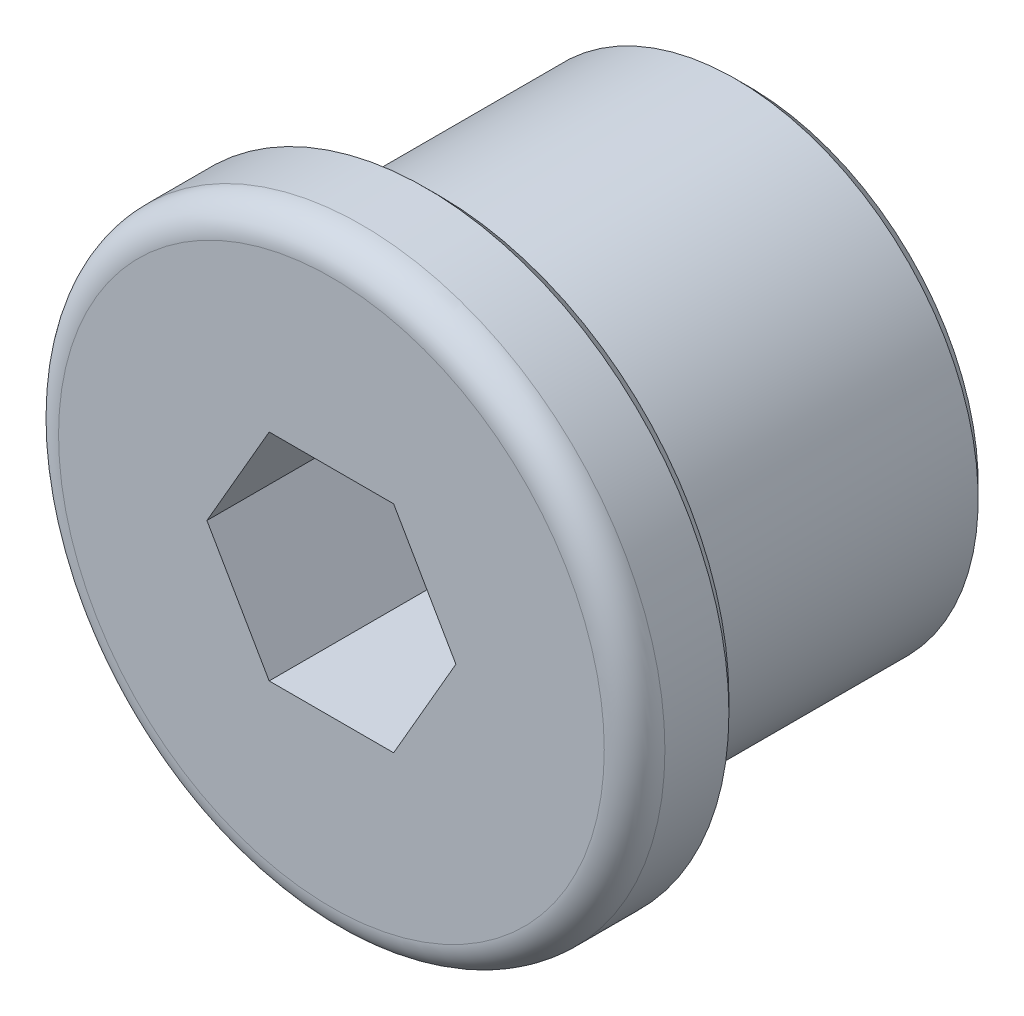
ISO-10303-21;
HEADER;
FILE_DESCRIPTION(('STEP AP214'),'2;1');
FILE_NAME('part.step','',(''),(''),'','','');
FILE_SCHEMA(('AUTOMOTIVE_DESIGN { 1 0 10303 214 1 1 1 1 }'));
ENDSEC;
DATA;
#1=APPLICATION_CONTEXT('core data for automotive mechanical design processes');
#2=APPLICATION_PROTOCOL_DEFINITION('international standard','automotive_design',2000,#1);
#3=PRODUCT_CONTEXT('',#1,'mechanical');
#4=PRODUCT('Part','Part','',(#3));
#5=PRODUCT_RELATED_PRODUCT_CATEGORY('part','',(#4));
#6=PRODUCT_DEFINITION_FORMATION('','',#4);
#7=PRODUCT_DEFINITION_CONTEXT('part definition',#1,'design');
#8=PRODUCT_DEFINITION('design','',#6,#7);
#9=PRODUCT_DEFINITION_SHAPE('','',#8);
#10=(LENGTH_UNIT() NAMED_UNIT(*) SI_UNIT(.MILLI.,.METRE.));
#11=(NAMED_UNIT(*) PLANE_ANGLE_UNIT() SI_UNIT($,.RADIAN.));
#12=(NAMED_UNIT(*) SI_UNIT($,.STERADIAN.) SOLID_ANGLE_UNIT());
#13=UNCERTAINTY_MEASURE_WITH_UNIT(LENGTH_MEASURE(1.E-05),#10,'distance_accuracy_value','');
#14=(GEOMETRIC_REPRESENTATION_CONTEXT(3) GLOBAL_UNCERTAINTY_ASSIGNED_CONTEXT((#13)) GLOBAL_UNIT_ASSIGNED_CONTEXT((#10,
#11,#12)) REPRESENTATION_CONTEXT('',''));
#15=CARTESIAN_POINT('',(0.,0.,0.));
#16=DIRECTION('',(0.,0.,1.));
#17=DIRECTION('',(1.,0.,0.));
#18=AXIS2_PLACEMENT_3D('',#15,#16,#17);
#19=CARTESIAN_POINT('',(0.,0.,18.));
#20=DIRECTION('',(0.,0.,1.));
#21=DIRECTION('',(1.,0.,0.));
#22=AXIS2_PLACEMENT_3D('',#19,#20,#21);
#23=CYLINDRICAL_SURFACE('',#22,9.);
#24=CARTESIAN_POINT('',(0.,0.,13.));
#25=DIRECTION('',(0.,0.,-1.));
#26=DIRECTION('',(-1.,0.,0.));
#27=AXIS2_PLACEMENT_3D('',#24,#25,#26);
#28=CIRCLE('',#27,9.);
#29=CARTESIAN_POINT('',(-9.,0.,13.));
#30=VERTEX_POINT('',#29);
#31=EDGE_CURVE('E41',#30,#30,#28,.T.);
#32=ORIENTED_EDGE('',*,*,#31,.T.);
#33=EDGE_LOOP('',(#32));
#34=FACE_BOUND('',#33,.T.);
#35=CARTESIAN_POINT('',(0.,0.,3.));
#36=DIRECTION('',(0.,0.,-1.));
#37=DIRECTION('',(-1.,0.,0.));
#38=AXIS2_PLACEMENT_3D('',#35,#36,#37);
#39=CIRCLE('',#38,9.);
#40=CARTESIAN_POINT('',(-9.,0.,3.));
#41=VERTEX_POINT('',#40);
#42=EDGE_CURVE('E134',#41,#41,#39,.F.);
#43=ORIENTED_EDGE('',*,*,#42,.T.);
#44=EDGE_LOOP('',(#43));
#45=FACE_BOUND('',#44,.T.);
#46=ADVANCED_FACE('F33',(#34,#45),#23,.T.);
#47=CARTESIAN_POINT('',(0.,0.,14.));
#48=DIRECTION('',(0.,0.,-1.));
#49=DIRECTION('',(-1.,0.,0.));
#50=AXIS2_PLACEMENT_3D('',#47,#48,#49);
#51=PLANE('',#50);
#52=CARTESIAN_POINT('',(0.,0.,14.));
#53=DIRECTION('',(0.,0.,-1.));
#54=DIRECTION('',(-1.,0.,0.));
#55=AXIS2_PLACEMENT_3D('',#52,#53,#54);
#56=CIRCLE('',#55,10.);
#57=CARTESIAN_POINT('',(-10.,0.,14.));
#58=VERTEX_POINT('',#57);
#59=EDGE_CURVE('E11',#58,#58,#56,.F.);
#60=ORIENTED_EDGE('',*,*,#59,.T.);
#61=EDGE_LOOP('',(#60));
#62=FACE_BOUND('',#61,.T.);
#63=CARTESIAN_POINT('',(0.,0.,14.));
#64=DIRECTION('',(0.,0.,-1.));
#65=DIRECTION('',(-1.,0.,0.));
#66=AXIS2_PLACEMENT_3D('',#63,#64,#65);
#67=CIRCLE('',#66,10.75);
#68=CARTESIAN_POINT('',(-10.75,0.,14.));
#69=VERTEX_POINT('',#68);
#70=EDGE_CURVE('E137',#69,#69,#67,.T.);
#71=ORIENTED_EDGE('',*,*,#70,.T.);
#72=EDGE_LOOP('',(#71));
#73=FACE_BOUND('',#72,.T.);
#74=ADVANCED_FACE('F93',(#62,#73),#51,.T.);
#75=CARTESIAN_POINT('',(0.,0.,6.33333457666696));
#76=DIRECTION('',(0.,0.,1.));
#77=DIRECTION('',(1.,0.,0.));
#78=AXIS2_PLACEMENT_3D('',#75,#76,#77);
#79=CONICAL_SURFACE('',#78,0.,1.0471975511966);
#80=CARTESIAN_POINT('',(0.,0.,6.33333457666696));
#81=VERTEX_POINT('',#80);
#82=VERTEX_LOOP('',#81);
#83=FACE_BOUND('',#82,.T.);
#84=CARTESIAN_POINT('',(4.61880011547006,-2.E-07,9.00000006666667));
#85=CARTESIAN_POINT('',(4.51731596975242,0.175775496545668,8.94139117877067));
#86=CARTESIAN_POINT('',(4.41495581433698,0.353068486395855,8.88808946175357));
#87=CARTESIAN_POINT('',(4.20846320572685,0.710724175896032,8.7950529136606));
#88=CARTESIAN_POINT('',(4.10432708475128,0.891093228328859,8.75535099179968));
#89=CARTESIAN_POINT('',(3.89734534960357,1.24959610984346,8.69355208547845));
#90=CARTESIAN_POINT('',(3.79453157331127,1.42767479409974,8.67104374713357));
#91=CARTESIAN_POINT('',(3.58842050010459,1.78466964489627,8.64417850885721));
#92=CARTESIAN_POINT('',(3.48512395183433,1.96358451474684,8.63979935685316));
#93=CARTESIAN_POINT('',(3.29212541755815,2.29786778189951,8.648932735896));
#94=CARTESIAN_POINT('',(3.20239447061298,2.45328634101981,8.66020271965585));
#95=CARTESIAN_POINT('',(3.02351714459821,2.76311095799946,8.69591473701546));
#96=CARTESIAN_POINT('',(2.93437138375617,2.91751594505726,8.72036895784161));
#97=CARTESIAN_POINT('',(2.75512555330313,3.2279788304468,8.78149977936056));
#98=CARTESIAN_POINT('',(2.66504815823741,3.38399745531408,8.81843538881991));
#99=CARTESIAN_POINT('',(2.48623648421218,3.69370835971222,8.90226360820786));
#100=CARTESIAN_POINT('',(2.39749991623392,3.84740460393987,8.94913653447237));
#101=CARTESIAN_POINT('',(2.30939988452995,3.99999833499957,9.00000006666667));
#102=B_SPLINE_CURVE_WITH_KNOTS('',3,(#84,#85,#86,#87,#88,#89,#90,#91,#92,#93,#94,#95,#96,#97,
#98,#99,#100,#101),.UNSPECIFIED.,.F.,.F.,(4,2,2,2,2,2,2,2,4),(0.,0.634031743308238,
1.26958707416591,1.88941437772395,2.50848066870244,3.047414307093,3.58684698049291,
4.13824168880611,4.6885542415222),.UNSPECIFIED.);
#103=CARTESIAN_POINT('',(4.6188,0.,9.));
#104=VERTEX_POINT('',#103);
#105=CARTESIAN_POINT('',(2.3094,3.99999813499957,9.));
#106=VERTEX_POINT('',#105);
#107=EDGE_CURVE('E97',#104,#106,#102,.T.);
#108=ORIENTED_EDGE('',*,*,#107,.T.);
#109=CARTESIAN_POINT('',(-5.98057769943966,3.99999813499956,10.4873404625172));
#110=CARTESIAN_POINT('',(-5.80634385912593,3.99999813499956,10.4037503812935));
#111=CARTESIAN_POINT('',(-5.6316820977662,3.99999813499956,10.3210352259282));
#112=CARTESIAN_POINT('',(-5.28127125241568,3.99999813499956,10.157857065314));
#113=CARTESIAN_POINT('',(-5.10552197120651,3.99999813499956,10.0773944841024));
#114=CARTESIAN_POINT('',(-4.75169185819257,3.99999813499956,9.91877225875573));
#115=CARTESIAN_POINT('',(-4.57360334159642,3.99999813499956,9.84062969131583));
#116=CARTESIAN_POINT('',(-4.2159125290911,3.99999813499956,9.68790338665811));
#117=CARTESIAN_POINT('',(-4.03631031769862,3.99999813499956,9.61331945227385));
#118=CARTESIAN_POINT('',(-3.67372739648014,3.99999813499956,9.46803650828329));
#119=CARTESIAN_POINT('',(-3.49073090183029,3.99999813499956,9.39737666668678));
#120=CARTESIAN_POINT('',(-3.12253565794429,3.99999813499956,9.26193338774639));
#121=CARTESIAN_POINT('',(-2.93733666262374,3.99999813499956,9.19715061415591));
#122=CARTESIAN_POINT('',(-2.56486875604118,3.99999813499956,9.07529545963009));
#123=CARTESIAN_POINT('',(-2.37760564994107,3.99999813499956,9.01820552373652));
#124=CARTESIAN_POINT('',(-2.00043406162686,3.99999813499956,8.91366929255565));
#125=CARTESIAN_POINT('',(-1.81052646930233,3.99999813499956,8.86621983314915));
#126=CARTESIAN_POINT('',(-1.42743382834547,3.99999813499956,8.78323057739448));
#127=CARTESIAN_POINT('',(-1.23424018509159,3.99999813499957,8.74772968311017));
#128=CARTESIAN_POINT('',(-0.84568086068928,3.99999813499957,8.69129080776628));
#129=CARTESIAN_POINT('',(-0.650315148594067,3.99999813499957,8.67035303446712));
#130=CARTESIAN_POINT('',(-0.259563873743043,3.99999813499957,8.64489362964313));
#131=CARTESIAN_POINT('',(-0.0641842773872174,3.99999813499957,8.64028273605792));
#132=CARTESIAN_POINT('',(0.326217426011319,3.99999813499957,8.64766335794575));
#133=CARTESIAN_POINT('',(0.521239602425259,3.99999813499956,8.65965121010483));
#134=CARTESIAN_POINT('',(0.858587464125004,3.99999813499956,8.69392875772315));
#135=CARTESIAN_POINT('',(1.00128992733535,3.99999813499957,8.7126822419693));
#136=CARTESIAN_POINT('',(1.28549923966592,3.99999813499957,8.75778211303508));
#137=CARTESIAN_POINT('',(1.4270058880511,3.99999813499957,8.78412974957018));
#138=CARTESIAN_POINT('',(1.84999884917977,3.99999813499957,8.87324006695584));
#139=CARTESIAN_POINT('',(2.12939329115907,3.99999813499957,8.94600570112461));
#140=CARTESIAN_POINT('',(2.54704256482357,3.99999813499957,9.07029059965774));
#141=CARTESIAN_POINT('',(2.68750495956953,3.99999813499957,9.11479931034816));
#142=CARTESIAN_POINT('',(2.96707353830311,3.99999813499957,9.20796385174562));
#143=CARTESIAN_POINT('',(3.10617960498509,3.99999813499957,9.2566200376742));
#144=CARTESIAN_POINT('',(3.38233764002496,3.99999813499957,9.35705946377575));
#145=CARTESIAN_POINT('',(3.51939682833038,3.99999813499957,9.40882304878702));
#146=CARTESIAN_POINT('',(3.79237111729086,3.99999813499957,9.51515891272153));
#147=CARTESIAN_POINT('',(3.92828658178818,3.99999813499957,9.56973025584892));
#148=CARTESIAN_POINT('',(4.06372392451126,3.99999813499957,9.62543811972496));
#149=B_SPLINE_CURVE_WITH_KNOTS('',3,(#109,#110,#111,#112,#113,#114,#115,#116,#117,#118,#119,
#120,#121,#122,#123,#124,#125,#126,#127,#128,#129,#130,#131,#132,#133,#134,#135,#136,#137,#138,
#139,#140,#141,#142,#143,#144,#145,#146,#147,#148),.UNSPECIFIED.,.F.,.F.,(4,2,2,2,2,2,2,2,2,2,2,
2,2,2,2,2,2,2,2,4),(0.,0.579752123938162,1.15961265969032,1.74301648077971,2.32638794069657,
2.91480363088888,3.50328569396402,4.09040124492338,4.67732378516358,5.26613914562134,
5.85496290606561,6.44056244511029,7.02603276396524,7.45760764225355,7.88925358233053,
8.75424356485996,9.19624933400552,9.6382929980216,10.0777870105018,10.5171354813762),.UNSPECIFIED.);
#150=CARTESIAN_POINT('',(-2.3094,3.99999813499956,9.));
#151=VERTEX_POINT('',#150);
#152=EDGE_CURVE('E98',#106,#151,#149,.F.);
#153=ORIENTED_EDGE('',*,*,#152,.T.);
#154=CARTESIAN_POINT('',(-2.30939988452995,3.99999833499956,9.00000006666667));
#155=CARTESIAN_POINT('',(-2.41088403024759,3.8242226384539,8.94139117877067));
#156=CARTESIAN_POINT('',(-2.51324418566302,3.64692964860371,8.88808946175357));
#157=CARTESIAN_POINT('',(-2.71973679427315,3.28927395910353,8.7950529136606));
#158=CARTESIAN_POINT('',(-2.82387291524872,3.1089049066707,8.75535099179968));
#159=CARTESIAN_POINT('',(-3.03085465039643,2.7504020251561,8.69355208547845));
#160=CARTESIAN_POINT('',(-3.13366842668873,2.57232334089982,8.67104374713357));
#161=CARTESIAN_POINT('',(-3.33977949989542,2.21532849010329,8.64417850885721));
#162=CARTESIAN_POINT('',(-3.44307604816567,2.03641362025272,8.63979935685316));
#163=CARTESIAN_POINT('',(-3.63607458244185,1.70213035310006,8.648932735896));
#164=CARTESIAN_POINT('',(-3.72580552938702,1.54671179397975,8.66020271965585));
#165=CARTESIAN_POINT('',(-3.90468285540179,1.23688717700011,8.69591473701546));
#166=CARTESIAN_POINT('',(-3.99382861624383,1.08248218994231,8.72036895784161));
#167=CARTESIAN_POINT('',(-4.17307444669687,0.772019304552769,8.78149977936056));
#168=CARTESIAN_POINT('',(-4.26315184176259,0.616000679685492,8.81843538881991));
#169=CARTESIAN_POINT('',(-4.44196351578782,0.306289775287347,8.90226360820786));
#170=CARTESIAN_POINT('',(-4.53070008376608,0.152593531059705,8.94913653447237));
#171=CARTESIAN_POINT('',(-4.61880011547005,-1.99999998937714E-07,9.00000006666667));
#172=B_SPLINE_CURVE_WITH_KNOTS('',3,(#154,#155,#156,#157,#158,#159,#160,#161,#162,#163,#164,
#165,#166,#167,#168,#169,#170,#171),.UNSPECIFIED.,.F.,.F.,(4,2,2,2,2,2,2,2,4),(0.,
0.634031743308237,1.26958707416591,1.88941437772395,2.50848066870243,3.04741430709299,
3.58684698049291,4.1382416888061,4.68855424152219),.UNSPECIFIED.);
#173=CARTESIAN_POINT('',(-4.6188,0.,9.));
#174=VERTEX_POINT('',#173);
#175=EDGE_CURVE('E56',#151,#174,#172,.T.);
#176=ORIENTED_EDGE('',*,*,#175,.T.);
#177=CARTESIAN_POINT('',(-4.61880011547006,2.00000001038552E-07,9.00000006666667));
#178=CARTESIAN_POINT('',(-4.51731596975242,-0.175775496545667,8.94139117877068));
#179=CARTESIAN_POINT('',(-4.41495581433698,-0.353068486395853,8.88808946175357));
#180=CARTESIAN_POINT('',(-4.20846320572685,-0.710724175896029,8.7950529136606));
#181=CARTESIAN_POINT('',(-4.10432708475128,-0.891093228328856,8.75535099179968));
#182=CARTESIAN_POINT('',(-3.89734534960357,-1.24959610984346,8.69355208547845));
#183=CARTESIAN_POINT('',(-3.79453157331127,-1.42767479409974,8.67104374713357));
#184=CARTESIAN_POINT('',(-3.58842050010459,-1.78466964489627,8.64417850885721));
#185=CARTESIAN_POINT('',(-3.48512395183433,-1.96358451474684,8.63979935685316));
#186=CARTESIAN_POINT('',(-3.29212541755815,-2.2978677818995,8.648932735896));
#187=CARTESIAN_POINT('',(-3.20239447061298,-2.45328634101981,8.66020271965585));
#188=CARTESIAN_POINT('',(-3.02351714459821,-2.76311095799945,8.69591473701546));
#189=CARTESIAN_POINT('',(-2.93437138375617,-2.91751594505726,8.72036895784161));
#190=CARTESIAN_POINT('',(-2.75512555330313,-3.22797883044679,8.78149977936056));
#191=CARTESIAN_POINT('',(-2.66504815823741,-3.38399745531407,8.81843538881991));
#192=CARTESIAN_POINT('',(-2.48623648421218,-3.69370835971222,8.90226360820786));
#193=CARTESIAN_POINT('',(-2.39749991623392,-3.84740460393986,8.94913653447237));
#194=CARTESIAN_POINT('',(-2.30939988452995,-3.99999833499956,9.00000006666667));
#195=B_SPLINE_CURVE_WITH_KNOTS('',3,(#177,#178,#179,#180,#181,#182,#183,#184,#185,#186,#187,
#188,#189,#190,#191,#192,#193,#194),.UNSPECIFIED.,.F.,.F.,(4,2,2,2,2,2,2,2,4),(0.,
0.634031743308238,1.26958707416591,1.88941437772395,2.50848066870243,3.04741430709299,
3.58684698049291,4.13824168880611,4.6885542415222),.UNSPECIFIED.);
#196=CARTESIAN_POINT('',(-2.3094,-3.99999813499957,9.));
#197=VERTEX_POINT('',#196);
#198=EDGE_CURVE('E230',#174,#197,#195,.T.);
#199=ORIENTED_EDGE('',*,*,#198,.T.);
#200=CARTESIAN_POINT('',(-5.98057769943966,-3.99999813499956,10.4873404625172));
#201=CARTESIAN_POINT('',(-5.80634385912592,-3.99999813499957,10.4037503812935));
#202=CARTESIAN_POINT('',(-5.63168209776621,-3.99999813499957,10.3210352259282));
#203=CARTESIAN_POINT('',(-5.28127125241568,-3.99999813499957,10.157857065314));
#204=CARTESIAN_POINT('',(-5.10552197120652,-3.99999813499957,10.0773944841024));
#205=CARTESIAN_POINT('',(-4.75169185819257,-3.99999813499957,9.91877225875573));
#206=CARTESIAN_POINT('',(-4.57360334159642,-3.99999813499957,9.84062969131583));
#207=CARTESIAN_POINT('',(-4.21591252909111,-3.99999813499957,9.68790338665811));
#208=CARTESIAN_POINT('',(-4.03631031769862,-3.99999813499957,9.61331945227385));
#209=CARTESIAN_POINT('',(-3.67372739648015,-3.99999813499957,9.46803650828329));
#210=CARTESIAN_POINT('',(-3.49073090183029,-3.99999813499957,9.39737666668678));
#211=CARTESIAN_POINT('',(-3.12253565794429,-3.99999813499957,9.26193338774639));
#212=CARTESIAN_POINT('',(-2.93733666262375,-3.99999813499957,9.19715061415591));
#213=CARTESIAN_POINT('',(-2.56486875604118,-3.99999813499957,9.07529545963009));
#214=CARTESIAN_POINT('',(-2.37760564994107,-3.99999813499957,9.01820552373652));
#215=CARTESIAN_POINT('',(-2.00043406162686,-3.99999813499957,8.91366929255565));
#216=CARTESIAN_POINT('',(-1.81052646930233,-3.99999813499956,8.86621983314915));
#217=CARTESIAN_POINT('',(-1.42743382834547,-3.99999813499956,8.78323057739448));
#218=CARTESIAN_POINT('',(-1.23424018509159,-3.99999813499957,8.74772968311017));
#219=CARTESIAN_POINT('',(-0.845680860689278,-3.99999813499957,8.69129080776628));
#220=CARTESIAN_POINT('',(-0.650315148594064,-3.99999813499957,8.67035303446712));
#221=CARTESIAN_POINT('',(-0.259563873743039,-3.99999813499957,8.64489362964313));
#222=CARTESIAN_POINT('',(-0.0641842773872144,-3.99999813499956,8.64028273605792));
#223=CARTESIAN_POINT('',(0.326217426011322,-3.99999813499956,8.64766335794575));
#224=CARTESIAN_POINT('',(0.521239602425262,-3.99999813499956,8.65965121010483));
#225=CARTESIAN_POINT('',(0.858587464125007,-3.99999813499956,8.69392875772315));
#226=CARTESIAN_POINT('',(1.00128992733535,-3.99999813499956,8.7126822419693));
#227=CARTESIAN_POINT('',(1.28549923966592,-3.99999813499956,8.75778211303507));
#228=CARTESIAN_POINT('',(1.4270058880511,-3.99999813499956,8.78412974957018));
#229=CARTESIAN_POINT('',(1.84999884917977,-3.99999813499956,8.87324006695584));
#230=CARTESIAN_POINT('',(2.12939329115907,-3.99999813499956,8.9460057011246));
#231=CARTESIAN_POINT('',(2.54704256482357,-3.99999813499956,9.07029059965774));
#232=CARTESIAN_POINT('',(2.68750495956952,-3.99999813499956,9.11479931034816));
#233=CARTESIAN_POINT('',(2.96707353830311,-3.99999813499956,9.20796385174561));
#234=CARTESIAN_POINT('',(3.10617960498509,-3.99999813499956,9.2566200376742));
#235=CARTESIAN_POINT('',(3.38233764002496,-3.99999813499956,9.35705946377575));
#236=CARTESIAN_POINT('',(3.51939682833038,-3.99999813499956,9.40882304878701));
#237=CARTESIAN_POINT('',(3.79237111729086,-3.99999813499956,9.51515891272153));
#238=CARTESIAN_POINT('',(3.92828658178818,-3.99999813499956,9.56973025584892));
#239=CARTESIAN_POINT('',(4.06372392451126,-3.99999813499956,9.62543811972496));
#240=B_SPLINE_CURVE_WITH_KNOTS('',3,(#200,#201,#202,#203,#204,#205,#206,#207,#208,#209,#210,
#211,#212,#213,#214,#215,#216,#217,#218,#219,#220,#221,#222,#223,#224,#225,#226,#227,#228,#229,
#230,#231,#232,#233,#234,#235,#236,#237,#238,#239),.UNSPECIFIED.,.F.,.F.,(4,2,2,2,2,2,2,2,2,2,2,
2,2,2,2,2,2,2,2,4),(0.,0.579752123938159,1.15961265969032,1.7430164807797,2.32638794069656,
2.91480363088887,3.50328569396402,4.09040124492337,4.67732378516358,5.26613914562134,
5.85496290606561,6.44056244511029,7.02603276396525,7.45760764225355,7.88925358233053,
8.75424356485995,9.19624933400552,9.6382929980216,10.0777870105018,10.5171354813762),.UNSPECIFIED.);
#241=CARTESIAN_POINT('',(2.3094,-3.99999813499956,9.));
#242=VERTEX_POINT('',#241);
#243=EDGE_CURVE('E235',#197,#242,#240,.T.);
#244=ORIENTED_EDGE('',*,*,#243,.T.);
#245=CARTESIAN_POINT('',(2.30939988452995,-3.99999833499956,9.00000006666667));
#246=CARTESIAN_POINT('',(2.41088403024758,-3.8242226384539,8.94139117877067));
#247=CARTESIAN_POINT('',(2.51324418566302,-3.64692964860371,8.88808946175357));
#248=CARTESIAN_POINT('',(2.71973679427315,-3.28927395910353,8.7950529136606));
#249=CARTESIAN_POINT('',(2.82387291524872,-3.10890490667071,8.75535099179968));
#250=CARTESIAN_POINT('',(3.03085465039643,-2.75040202515611,8.69355208547845));
#251=CARTESIAN_POINT('',(3.13366842668873,-2.57232334089983,8.67104374713357));
#252=CARTESIAN_POINT('',(3.33977949989542,-2.2153284901033,8.64417850885721));
#253=CARTESIAN_POINT('',(3.44307604816567,-2.03641362025273,8.63979935685316));
#254=CARTESIAN_POINT('',(3.63607458244185,-1.70213035310006,8.648932735896));
#255=CARTESIAN_POINT('',(3.72580552938702,-1.54671179397976,8.66020271965585));
#256=CARTESIAN_POINT('',(3.90468285540179,-1.23688717700011,8.69591473701546));
#257=CARTESIAN_POINT('',(3.99382861624383,-1.08248218994231,8.72036895784161));
#258=CARTESIAN_POINT('',(4.17307444669687,-0.772019304552768,8.78149977936056));
#259=CARTESIAN_POINT('',(4.26315184176259,-0.616000679685489,8.81843538881991));
#260=CARTESIAN_POINT('',(4.44196351578782,-0.306289775287344,8.90226360820786));
#261=CARTESIAN_POINT('',(4.53070008376609,-0.152593531059702,8.94913653447237));
#262=CARTESIAN_POINT('',(4.61880011547006,1.99999999986316E-07,9.00000006666667));
#263=B_SPLINE_CURVE_WITH_KNOTS('',3,(#245,#246,#247,#248,#249,#250,#251,#252,#253,#254,#255,
#256,#257,#258,#259,#260,#261,#262),.UNSPECIFIED.,.F.,.F.,(4,2,2,2,2,2,2,2,4),(0.,
0.634031743308236,1.26958707416591,1.88941437772395,2.50848066870243,3.04741430709299,
3.58684698049291,4.13824168880611,4.6885542415222),.UNSPECIFIED.);
#264=EDGE_CURVE('E101',#242,#104,#263,.T.);
#265=ORIENTED_EDGE('',*,*,#264,.T.);
#266=EDGE_LOOP('',(#108,#153,#176,#199,#244,#265));
#267=FACE_BOUND('',#266,.T.);
#268=ADVANCED_FACE('F89',(#83,#267),#79,.F.);
#269=CARTESIAN_POINT('',(-4.6188,0.,6.33333457666696));
#270=DIRECTION('',(0.866025403784439,-0.5,0.));
#271=DIRECTION('',(-0.5,-0.866025403784439,0.));
#272=AXIS2_PLACEMENT_3D('',#269,#270,#271);
#273=PLANE('',#272);
#274=DIRECTION('',(0.,0.,1.));
#275=VECTOR('',#274,1.);
#276=CARTESIAN_POINT('',(-2.3094,3.99999813499956,6.33333457666696));
#277=LINE('',#276,#275);
#278=CARTESIAN_POINT('',(-2.3094,3.99999813499956,18.));
#279=VERTEX_POINT('',#278);
#280=EDGE_CURVE('E109',#151,#279,#277,.T.);
#281=ORIENTED_EDGE('',*,*,#280,.T.);
#282=DIRECTION('',(0.5,0.866025403784439,0.));
#283=VECTOR('',#282,1.);
#284=CARTESIAN_POINT('',(-4.6188,0.,18.));
#285=LINE('',#284,#283);
#286=CARTESIAN_POINT('',(-4.6188,0.,18.));
#287=VERTEX_POINT('',#286);
#288=EDGE_CURVE('E114',#287,#279,#285,.T.);
#289=ORIENTED_EDGE('',*,*,#288,.F.);
#290=DIRECTION('',(0.,0.,1.));
#291=VECTOR('',#290,1.);
#292=CARTESIAN_POINT('',(-4.6188,0.,6.33333457666696));
#293=LINE('',#292,#291);
#294=EDGE_CURVE('E112',#174,#287,#293,.T.);
#295=ORIENTED_EDGE('',*,*,#294,.F.);
#296=ORIENTED_EDGE('',*,*,#175,.F.);
#297=EDGE_LOOP('',(#281,#289,#295,#296));
#298=FACE_BOUND('',#297,.T.);
#299=ADVANCED_FACE('F92',(#298),#273,.T.);
#300=CARTESIAN_POINT('',(-2.3094,-3.99999813499956,6.33333457666696));
#301=DIRECTION('',(0.866025403784439,0.5,0.));
#302=DIRECTION('',(0.5,-0.866025403784439,0.));
#303=AXIS2_PLACEMENT_3D('',#300,#301,#302);
#304=PLANE('',#303);
#305=ORIENTED_EDGE('',*,*,#294,.T.);
#306=DIRECTION('',(-0.5,0.866025403784439,0.));
#307=VECTOR('',#306,1.);
#308=CARTESIAN_POINT('',(-2.3094,-3.99999813499956,18.));
#309=LINE('',#308,#307);
#310=CARTESIAN_POINT('',(-2.3094,-3.99999813499956,18.));
#311=VERTEX_POINT('',#310);
#312=EDGE_CURVE('E191',#311,#287,#309,.T.);
#313=ORIENTED_EDGE('',*,*,#312,.F.);
#314=DIRECTION('',(0.,0.,1.));
#315=VECTOR('',#314,1.);
#316=CARTESIAN_POINT('',(-2.3094,-3.99999813499956,6.33333457666696));
#317=LINE('',#316,#315);
#318=EDGE_CURVE('E119',#197,#311,#317,.T.);
#319=ORIENTED_EDGE('',*,*,#318,.F.);
#320=ORIENTED_EDGE('',*,*,#198,.F.);
#321=EDGE_LOOP('',(#305,#313,#319,#320));
#322=FACE_BOUND('',#321,.T.);
#323=ADVANCED_FACE('F244',(#322),#304,.T.);
#324=CARTESIAN_POINT('',(2.3094,-3.99999813499956,6.33333457666696));
#325=DIRECTION('',(0.,1.,0.));
#326=DIRECTION('',(1.,0.,0.));
#327=AXIS2_PLACEMENT_3D('',#324,#325,#326);
#328=PLANE('',#327);
#329=ORIENTED_EDGE('',*,*,#318,.T.);
#330=DIRECTION('',(-1.,0.,0.));
#331=VECTOR('',#330,1.);
#332=CARTESIAN_POINT('',(2.3094,-3.99999813499956,18.));
#333=LINE('',#332,#331);
#334=CARTESIAN_POINT('',(2.3094,-3.99999813499956,18.));
#335=VERTEX_POINT('',#334);
#336=EDGE_CURVE('E196',#335,#311,#333,.T.);
#337=ORIENTED_EDGE('',*,*,#336,.F.);
#338=DIRECTION('',(0.,0.,1.));
#339=VECTOR('',#338,1.);
#340=CARTESIAN_POINT('',(2.3094,-3.99999813499956,6.33333457666696));
#341=LINE('',#340,#339);
#342=EDGE_CURVE('E121',#242,#335,#341,.T.);
#343=ORIENTED_EDGE('',*,*,#342,.F.);
#344=ORIENTED_EDGE('',*,*,#243,.F.);
#345=EDGE_LOOP('',(#329,#337,#343,#344));
#346=FACE_BOUND('',#345,.T.);
#347=ADVANCED_FACE('F240',(#346),#328,.T.);
#348=CARTESIAN_POINT('',(4.6188,0.,6.33333457666696));
#349=DIRECTION('',(-0.866025403784439,0.5,0.));
#350=DIRECTION('',(0.5,0.866025403784439,0.));
#351=AXIS2_PLACEMENT_3D('',#348,#349,#350);
#352=PLANE('',#351);
#353=ORIENTED_EDGE('',*,*,#342,.T.);
#354=DIRECTION('',(-0.5,-0.866025403784439,0.));
#355=VECTOR('',#354,1.);
#356=CARTESIAN_POINT('',(4.6188,0.,18.));
#357=LINE('',#356,#355);
#358=CARTESIAN_POINT('',(4.6188,0.,18.));
#359=VERTEX_POINT('',#358);
#360=EDGE_CURVE('E200',#359,#335,#357,.T.);
#361=ORIENTED_EDGE('',*,*,#360,.F.);
#362=DIRECTION('',(0.,0.,1.));
#363=VECTOR('',#362,1.);
#364=CARTESIAN_POINT('',(4.6188,0.,6.33333457666696));
#365=LINE('',#364,#363);
#366=EDGE_CURVE('E123',#104,#359,#365,.T.);
#367=ORIENTED_EDGE('',*,*,#366,.F.);
#368=ORIENTED_EDGE('',*,*,#264,.F.);
#369=EDGE_LOOP('',(#353,#361,#367,#368));
#370=FACE_BOUND('',#369,.T.);
#371=ADVANCED_FACE('F243',(#370),#352,.T.);
#372=CARTESIAN_POINT('',(2.3094,3.99999813499957,6.33333457666696));
#373=DIRECTION('',(-0.866025403784439,-0.5,0.));
#374=DIRECTION('',(-0.5,0.866025403784439,0.));
#375=AXIS2_PLACEMENT_3D('',#372,#373,#374);
#376=PLANE('',#375);
#377=ORIENTED_EDGE('',*,*,#366,.T.);
#378=DIRECTION('',(0.5,-0.866025403784439,0.));
#379=VECTOR('',#378,1.);
#380=CARTESIAN_POINT('',(2.3094,3.99999813499957,18.));
#381=LINE('',#380,#379);
#382=CARTESIAN_POINT('',(2.3094,3.99999813499957,18.));
#383=VERTEX_POINT('',#382);
#384=EDGE_CURVE('E48',#383,#359,#381,.T.);
#385=ORIENTED_EDGE('',*,*,#384,.F.);
#386=DIRECTION('',(0.,0.,1.));
#387=VECTOR('',#386,1.);
#388=CARTESIAN_POINT('',(2.3094,3.99999813499957,6.33333457666696));
#389=LINE('',#388,#387);
#390=EDGE_CURVE('E104',#106,#383,#389,.T.);
#391=ORIENTED_EDGE('',*,*,#390,.F.);
#392=ORIENTED_EDGE('',*,*,#107,.F.);
#393=EDGE_LOOP('',(#377,#385,#391,#392));
#394=FACE_BOUND('',#393,.T.);
#395=ADVANCED_FACE('F105',(#394),#376,.T.);
#396=CARTESIAN_POINT('',(-2.3094,3.99999813499956,6.33333457666696));
#397=DIRECTION('',(0.,-1.,0.));
#398=DIRECTION('',(-1.,0.,0.));
#399=AXIS2_PLACEMENT_3D('',#396,#397,#398);
#400=PLANE('',#399);
#401=ORIENTED_EDGE('',*,*,#390,.T.);
#402=DIRECTION('',(1.,0.,0.));
#403=VECTOR('',#402,1.);
#404=CARTESIAN_POINT('',(-2.3094,3.99999813499956,18.));
#405=LINE('',#404,#403);
#406=EDGE_CURVE('E110',#279,#383,#405,.T.);
#407=ORIENTED_EDGE('',*,*,#406,.F.);
#408=ORIENTED_EDGE('',*,*,#280,.F.);
#409=ORIENTED_EDGE('',*,*,#152,.F.);
#410=EDGE_LOOP('',(#401,#407,#408,#409));
#411=FACE_BOUND('',#410,.T.);
#412=ADVANCED_FACE('F180',(#411),#400,.T.);
#413=CARTESIAN_POINT('',(0.,0.,18.));
#414=DIRECTION('',(0.,0.,1.));
#415=DIRECTION('',(1.,0.,0.));
#416=AXIS2_PLACEMENT_3D('',#413,#414,#415);
#417=PLANE('',#416);
#418=CARTESIAN_POINT('',(0.,0.,18.));
#419=DIRECTION('',(0.,0.,1.));
#420=DIRECTION('',(1.,0.,0.));
#421=AXIS2_PLACEMENT_3D('',#418,#419,#420);
#422=CIRCLE('',#421,10.125);
#423=CARTESIAN_POINT('',(10.125,0.,18.));
#424=VERTEX_POINT('',#423);
#425=EDGE_CURVE('E128',#424,#424,#422,.T.);
#426=ORIENTED_EDGE('',*,*,#425,.T.);
#427=EDGE_LOOP('',(#426));
#428=FACE_BOUND('',#427,.T.);
#429=ORIENTED_EDGE('',*,*,#406,.T.);
#430=ORIENTED_EDGE('',*,*,#384,.T.);
#431=ORIENTED_EDGE('',*,*,#360,.T.);
#432=ORIENTED_EDGE('',*,*,#336,.T.);
#433=ORIENTED_EDGE('',*,*,#312,.T.);
#434=ORIENTED_EDGE('',*,*,#288,.T.);
#435=EDGE_LOOP('',(#429,#430,#431,#432,#433,#434));
#436=FACE_BOUND('',#435,.T.);
#437=ADVANCED_FACE('F35',(#428,#436),#417,.T.);
#438=CARTESIAN_POINT('',(0.,0.,16.875));
#439=DIRECTION('',(0.,0.,1.));
#440=DIRECTION('',(1.,0.,0.));
#441=AXIS2_PLACEMENT_3D('',#438,#439,#440);
#442=TOROIDAL_SURFACE('',#441,10.125,1.125);
#443=ORIENTED_EDGE('',*,*,#425,.F.);
#444=EDGE_LOOP('',(#443));
#445=FACE_BOUND('',#444,.T.);
#446=CARTESIAN_POINT('',(0.,0.,16.875));
#447=DIRECTION('',(0.,0.,1.));
#448=DIRECTION('',(1.,0.,0.));
#449=AXIS2_PLACEMENT_3D('',#446,#447,#448);
#450=CIRCLE('',#449,11.25);
#451=CARTESIAN_POINT('',(11.25,0.,16.875));
#452=VERTEX_POINT('',#451);
#453=EDGE_CURVE('E125',#452,#452,#450,.T.);
#454=ORIENTED_EDGE('',*,*,#453,.T.);
#455=EDGE_LOOP('',(#454));
#456=FACE_BOUND('',#455,.T.);
#457=ADVANCED_FACE('F173',(#445,#456),#442,.T.);
#458=CARTESIAN_POINT('',(0.,0.,18.));
#459=DIRECTION('',(0.,0.,1.));
#460=DIRECTION('',(1.,0.,0.));
#461=AXIS2_PLACEMENT_3D('',#458,#459,#460);
#462=CYLINDRICAL_SURFACE('',#461,11.25);
#463=CARTESIAN_POINT('',(0.,0.,14.5));
#464=DIRECTION('',(0.,0.,-1.));
#465=DIRECTION('',(-1.,0.,0.));
#466=AXIS2_PLACEMENT_3D('',#463,#464,#465);
#467=CIRCLE('',#466,11.25);
#468=CARTESIAN_POINT('',(-11.25,0.,14.5));
#469=VERTEX_POINT('',#468);
#470=EDGE_CURVE('E140',#469,#469,#467,.F.);
#471=ORIENTED_EDGE('',*,*,#470,.T.);
#472=EDGE_LOOP('',(#471));
#473=FACE_BOUND('',#472,.T.);
#474=ORIENTED_EDGE('',*,*,#453,.F.);
#475=EDGE_LOOP('',(#474));
#476=FACE_BOUND('',#475,.T.);
#477=ADVANCED_FACE('F170',(#473,#476),#462,.T.);
#478=CARTESIAN_POINT('',(0.,0.,2.5));
#479=DIRECTION('',(0.,0.,-1.));
#480=DIRECTION('',(-1.,0.,0.));
#481=AXIS2_PLACEMENT_3D('',#478,#479,#480);
#482=PLANE('',#481);
#483=CARTESIAN_POINT('',(0.,0.,2.5));
#484=DIRECTION('',(0.,0.,-1.));
#485=DIRECTION('',(-1.,0.,0.));
#486=AXIS2_PLACEMENT_3D('',#483,#484,#485);
#487=CIRCLE('',#486,8.49999999999999);
#488=CARTESIAN_POINT('',(-8.49999999999999,0.,2.5));
#489=VERTEX_POINT('',#488);
#490=EDGE_CURVE('E131',#489,#489,#487,.T.);
#491=ORIENTED_EDGE('',*,*,#490,.T.);
#492=EDGE_LOOP('',(#491));
#493=FACE_BOUND('',#492,.T.);
#494=ADVANCED_FACE('F172',(#493),#482,.T.);
#495=CARTESIAN_POINT('',(0.,0.,2.5));
#496=DIRECTION('',(0.,0.,1.));
#497=DIRECTION('',(1.,0.,0.));
#498=AXIS2_PLACEMENT_3D('',#495,#496,#497);
#499=CONICAL_SURFACE('',#498,8.49999999999999,0.785398163397453);
#500=ORIENTED_EDGE('',*,*,#42,.F.);
#501=EDGE_LOOP('',(#500));
#502=FACE_BOUND('',#501,.T.);
#503=ORIENTED_EDGE('',*,*,#490,.F.);
#504=EDGE_LOOP('',(#503));
#505=FACE_BOUND('',#504,.T.);
#506=ADVANCED_FACE('F155',(#502,#505),#499,.T.);
#507=CARTESIAN_POINT('',(0.,0.,14.));
#508=DIRECTION('',(0.,0.,1.));
#509=DIRECTION('',(1.,0.,0.));
#510=AXIS2_PLACEMENT_3D('',#507,#508,#509);
#511=CONICAL_SURFACE('',#510,10.75,0.785398163397453);
#512=ORIENTED_EDGE('',*,*,#470,.F.);
#513=EDGE_LOOP('',(#512));
#514=FACE_BOUND('',#513,.T.);
#515=ORIENTED_EDGE('',*,*,#70,.F.);
#516=EDGE_LOOP('',(#515));
#517=FACE_BOUND('',#516,.T.);
#518=ADVANCED_FACE('F149',(#514,#517),#511,.T.);
#519=CARTESIAN_POINT('',(0.,0.,13.));
#520=DIRECTION('',(0.,0.,-1.));
#521=DIRECTION('',(-1.,0.,0.));
#522=AXIS2_PLACEMENT_3D('',#519,#520,#521);
#523=TOROIDAL_SURFACE('',#522,10.,1.);
#524=ORIENTED_EDGE('',*,*,#59,.F.);
#525=EDGE_LOOP('',(#524));
#526=FACE_BOUND('',#525,.T.);
#527=ORIENTED_EDGE('',*,*,#31,.F.);
#528=EDGE_LOOP('',(#527));
#529=FACE_BOUND('',#528,.T.);
#530=ADVANCED_FACE('F147',(#526,#529),#523,.F.);
#531=CLOSED_SHELL('',(#46,#74,#268,#299,#323,#347,#371,#395,#412,#437,#457,#477,#494,#506,#518,#530));
#532=MANIFOLD_SOLID_BREP('B2',#531);
#533=ADVANCED_BREP_SHAPE_REPRESENTATION('',(#18,#532),#14);
#534=SHAPE_DEFINITION_REPRESENTATION(#9,#533);
ENDSEC;
END-ISO-10303-21;
